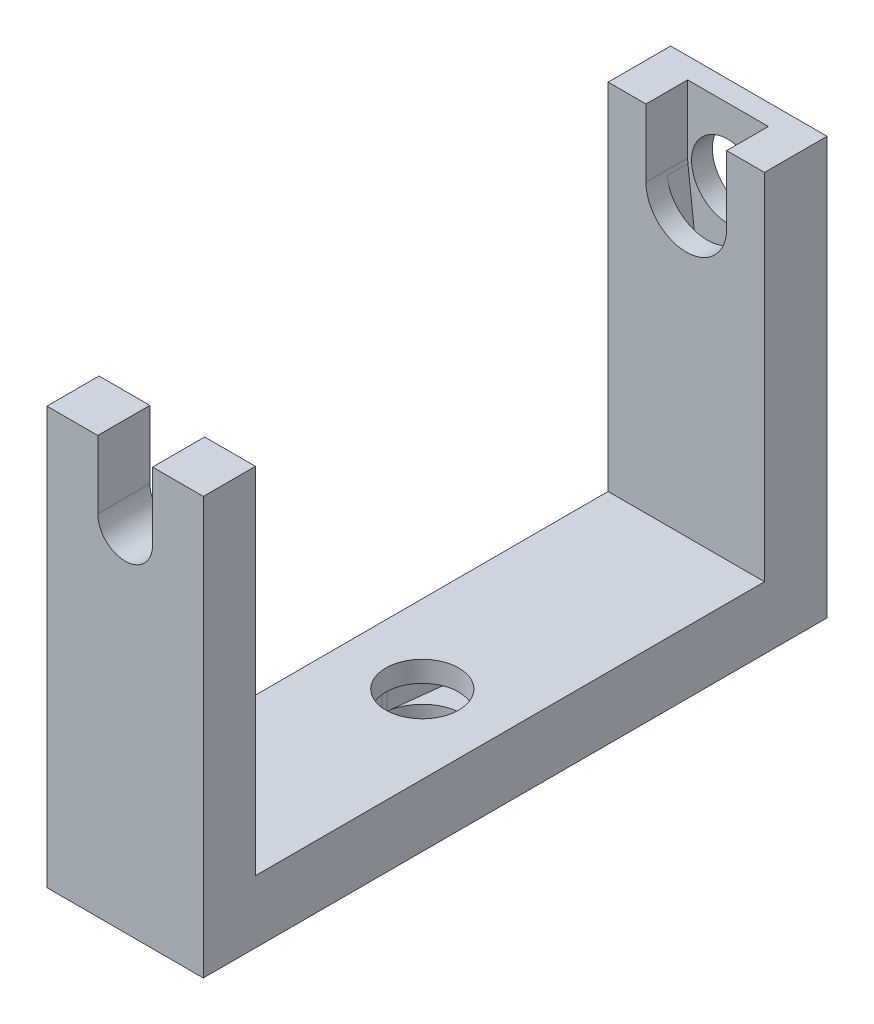
ISO-10303-21;
HEADER;
FILE_DESCRIPTION(('STEP AP214'),'2;1');
FILE_NAME('part.step','',(''),(''),'','','');
FILE_SCHEMA(('AUTOMOTIVE_DESIGN { 1 0 10303 214 1 1 1 1 }'));
ENDSEC;
DATA;
#1=APPLICATION_CONTEXT('core data for automotive mechanical design processes');
#2=APPLICATION_PROTOCOL_DEFINITION('international standard','automotive_design',2000,#1);
#3=PRODUCT_CONTEXT('',#1,'mechanical');
#4=PRODUCT('Part','Part','',(#3));
#5=PRODUCT_RELATED_PRODUCT_CATEGORY('part','',(#4));
#6=PRODUCT_DEFINITION_FORMATION('','',#4);
#7=PRODUCT_DEFINITION_CONTEXT('part definition',#1,'design');
#8=PRODUCT_DEFINITION('design','',#6,#7);
#9=PRODUCT_DEFINITION_SHAPE('','',#8);
#10=(LENGTH_UNIT() NAMED_UNIT(*) SI_UNIT(.MILLI.,.METRE.));
#11=(NAMED_UNIT(*) PLANE_ANGLE_UNIT() SI_UNIT($,.RADIAN.));
#12=(NAMED_UNIT(*) SI_UNIT($,.STERADIAN.) SOLID_ANGLE_UNIT());
#13=UNCERTAINTY_MEASURE_WITH_UNIT(LENGTH_MEASURE(1.E-05),#10,'distance_accuracy_value','');
#14=(GEOMETRIC_REPRESENTATION_CONTEXT(3) GLOBAL_UNCERTAINTY_ASSIGNED_CONTEXT((#13)) GLOBAL_UNIT_ASSIGNED_CONTEXT((#10,
#11,#12)) REPRESENTATION_CONTEXT('',''));
#15=CARTESIAN_POINT('',(0.,0.,0.));
#16=DIRECTION('',(0.,0.,1.));
#17=DIRECTION('',(1.,0.,0.));
#18=AXIS2_PLACEMENT_3D('',#15,#16,#17);
#19=CARTESIAN_POINT('',(7.5,37.,-15.91));
#20=DIRECTION('',(0.,-1.,0.));
#21=DIRECTION('',(0.,0.,-1.));
#22=AXIS2_PLACEMENT_3D('',#19,#20,#21);
#23=PLANE('',#22);
#24=DIRECTION('',(1.,0.,0.));
#25=VECTOR('',#24,1.);
#26=CARTESIAN_POINT('',(-7.5,36.9999999999999,37.91));
#27=LINE('',#26,#25);
#28=CARTESIAN_POINT('',(-7.5,36.9999999999999,37.91));
#29=VERTEX_POINT('',#28);
#30=CARTESIAN_POINT('',(-2.625,36.9999999999999,37.91));
#31=VERTEX_POINT('',#30);
#32=EDGE_CURVE('E258',#29,#31,#27,.T.);
#33=ORIENTED_EDGE('',*,*,#32,.T.);
#34=DIRECTION('',(0.,0.,1.));
#35=VECTOR('',#34,1.);
#36=CARTESIAN_POINT('',(-2.625,36.9999999999999,22.3825062336756));
#37=LINE('',#36,#35);
#38=CARTESIAN_POINT('',(-2.625,36.9999999999999,32.91));
#39=VERTEX_POINT('',#38);
#40=EDGE_CURVE('E251',#39,#31,#37,.T.);
#41=ORIENTED_EDGE('',*,*,#40,.F.);
#42=DIRECTION('',(-1.,0.,0.));
#43=VECTOR('',#42,1.);
#44=CARTESIAN_POINT('',(-7.5,36.9999999999999,32.91));
#45=LINE('',#44,#43);
#46=CARTESIAN_POINT('',(-7.5,36.9999999999999,32.91));
#47=VERTEX_POINT('',#46);
#48=EDGE_CURVE('E240',#39,#47,#45,.T.);
#49=ORIENTED_EDGE('',*,*,#48,.T.);
#50=DIRECTION('',(0.,0.,1.));
#51=VECTOR('',#50,1.);
#52=CARTESIAN_POINT('',(-7.5,36.9999999999999,37.91));
#53=LINE('',#52,#51);
#54=EDGE_CURVE('E261',#47,#29,#53,.T.);
#55=ORIENTED_EDGE('',*,*,#54,.T.);
#56=EDGE_LOOP('',(#33,#41,#49,#55));
#57=FACE_BOUND('',#56,.T.);
#58=ADVANCED_FACE('F33',(#57),#23,.F.);
#59=CARTESIAN_POINT('',(7.5,37.,-15.91));
#60=DIRECTION('',(0.,-1.,0.));
#61=DIRECTION('',(0.,0.,-1.));
#62=AXIS2_PLACEMENT_3D('',#59,#60,#61);
#63=PLANE('',#62);
#64=DIRECTION('',(0.,0.,1.));
#65=VECTOR('',#64,1.);
#66=CARTESIAN_POINT('',(3.86999999999998,37.,-19.91));
#67=LINE('',#66,#65);
#68=CARTESIAN_POINT('',(3.86999999999998,37.,-19.91));
#69=VERTEX_POINT('',#68);
#70=CARTESIAN_POINT('',(3.86999999999998,37.,-15.91));
#71=VERTEX_POINT('',#70);
#72=EDGE_CURVE('E393',#69,#71,#67,.T.);
#73=ORIENTED_EDGE('',*,*,#72,.T.);
#74=DIRECTION('',(-1.,0.,0.));
#75=VECTOR('',#74,1.);
#76=CARTESIAN_POINT('',(7.5,37.,-15.91));
#77=LINE('',#76,#75);
#78=CARTESIAN_POINT('',(7.5,37.,-15.91));
#79=VERTEX_POINT('',#78);
#80=EDGE_CURVE('E432',#79,#71,#77,.T.);
#81=ORIENTED_EDGE('',*,*,#80,.F.);
#82=DIRECTION('',(0.,0.,1.));
#83=VECTOR('',#82,1.);
#84=CARTESIAN_POINT('',(7.5,37.,-15.91));
#85=LINE('',#84,#83);
#86=CARTESIAN_POINT('',(7.5,37.,-21.91));
#87=VERTEX_POINT('',#86);
#88=EDGE_CURVE('E410',#87,#79,#85,.T.);
#89=ORIENTED_EDGE('',*,*,#88,.F.);
#90=DIRECTION('',(-1.,0.,0.));
#91=VECTOR('',#90,1.);
#92=CARTESIAN_POINT('',(7.5,37.,-21.91));
#93=LINE('',#92,#91);
#94=CARTESIAN_POINT('',(-7.5,37.,-21.91));
#95=VERTEX_POINT('',#94);
#96=EDGE_CURVE('E435',#87,#95,#93,.T.);
#97=ORIENTED_EDGE('',*,*,#96,.T.);
#98=DIRECTION('',(0.,0.,1.));
#99=VECTOR('',#98,1.);
#100=CARTESIAN_POINT('',(-7.5,37.,-15.91));
#101=LINE('',#100,#99);
#102=CARTESIAN_POINT('',(-7.5,37.,-15.91));
#103=VERTEX_POINT('',#102);
#104=EDGE_CURVE('E422',#95,#103,#101,.T.);
#105=ORIENTED_EDGE('',*,*,#104,.T.);
#106=CARTESIAN_POINT('',(-3.86999999999998,37.,-15.91));
#107=VERTEX_POINT('',#106);
#108=EDGE_CURVE('E431',#107,#103,#77,.T.);
#109=ORIENTED_EDGE('',*,*,#108,.F.);
#110=DIRECTION('',(0.,0.,1.));
#111=VECTOR('',#110,1.);
#112=CARTESIAN_POINT('',(-3.86999999999998,37.,-19.91));
#113=LINE('',#112,#111);
#114=CARTESIAN_POINT('',(-3.86999999999998,37.,-19.91));
#115=VERTEX_POINT('',#114);
#116=EDGE_CURVE('E391',#115,#107,#113,.T.);
#117=ORIENTED_EDGE('',*,*,#116,.F.);
#118=DIRECTION('',(-1.,0.,0.));
#119=VECTOR('',#118,1.);
#120=CARTESIAN_POINT('',(3.86999999999998,37.,-19.91));
#121=LINE('',#120,#119);
#122=EDGE_CURVE('E363',#69,#115,#121,.T.);
#123=ORIENTED_EDGE('',*,*,#122,.F.);
#124=EDGE_LOOP('',(#73,#81,#89,#97,#105,#109,#117,#123));
#125=FACE_BOUND('',#124,.T.);
#126=ADVANCED_FACE('F491',(#125),#63,.F.);
#127=CARTESIAN_POINT('',(7.5,3.,-15.91));
#128=DIRECTION('',(0.,0.,-1.));
#129=DIRECTION('',(-1.,0.,0.));
#130=AXIS2_PLACEMENT_3D('',#127,#128,#129);
#131=PLANE('',#130);
#132=DIRECTION('',(0.,1.,0.));
#133=VECTOR('',#132,1.);
#134=CARTESIAN_POINT('',(3.87000000000017,2.99999999999998,-15.91));
#135=LINE('',#134,#133);
#136=CARTESIAN_POINT('',(3.87000000000002,30.5,-15.91));
#137=VERTEX_POINT('',#136);
#138=EDGE_CURVE('E343',#137,#71,#135,.T.);
#139=ORIENTED_EDGE('',*,*,#138,.F.);
#140=CARTESIAN_POINT('',(0.,30.5,-15.91));
#141=DIRECTION('',(0.,0.,-1.));
#142=DIRECTION('',(-1.,0.,0.));
#143=AXIS2_PLACEMENT_3D('',#140,#141,#142);
#144=CIRCLE('',#143,3.87);
#145=CARTESIAN_POINT('',(-3.86999999999998,30.5,-15.91));
#146=VERTEX_POINT('',#145);
#147=EDGE_CURVE('E346',#146,#137,#144,.F.);
#148=ORIENTED_EDGE('',*,*,#147,.F.);
#149=DIRECTION('',(0.,-1.,0.));
#150=VECTOR('',#149,1.);
#151=CARTESIAN_POINT('',(-3.86999999999998,3.,-15.91));
#152=LINE('',#151,#150);
#153=EDGE_CURVE('E340',#107,#146,#152,.T.);
#154=ORIENTED_EDGE('',*,*,#153,.F.);
#155=ORIENTED_EDGE('',*,*,#108,.T.);
#156=DIRECTION('',(0.,-1.,0.));
#157=VECTOR('',#156,1.);
#158=CARTESIAN_POINT('',(-7.5,3.,-15.91));
#159=LINE('',#158,#157);
#160=CARTESIAN_POINT('',(-7.5,3.,-15.91));
#161=VERTEX_POINT('',#160);
#162=EDGE_CURVE('E425',#103,#161,#159,.T.);
#163=ORIENTED_EDGE('',*,*,#162,.T.);
#164=DIRECTION('',(-1.,0.,0.));
#165=VECTOR('',#164,1.);
#166=CARTESIAN_POINT('',(7.5,3.,-15.91));
#167=LINE('',#166,#165);
#168=CARTESIAN_POINT('',(7.5,3.,-15.91));
#169=VERTEX_POINT('',#168);
#170=EDGE_CURVE('E417',#169,#161,#167,.T.);
#171=ORIENTED_EDGE('',*,*,#170,.F.);
#172=DIRECTION('',(0.,-1.,0.));
#173=VECTOR('',#172,1.);
#174=CARTESIAN_POINT('',(7.5,3.,-15.91));
#175=LINE('',#174,#173);
#176=EDGE_CURVE('E412',#79,#169,#175,.T.);
#177=ORIENTED_EDGE('',*,*,#176,.F.);
#178=ORIENTED_EDGE('',*,*,#80,.T.);
#179=EDGE_LOOP('',(#139,#148,#154,#155,#163,#171,#177,#178));
#180=FACE_BOUND('',#179,.T.);
#181=ADVANCED_FACE('F498',(#180),#131,.F.);
#182=CARTESIAN_POINT('',(0.,16.42,-17.91));
#183=DIRECTION('',(0.,0.,1.));
#184=DIRECTION('',(1.,0.,0.));
#185=AXIS2_PLACEMENT_3D('',#182,#183,#184);
#186=PLANE('',#185);
#187=CARTESIAN_POINT('',(0.,30.5,-17.91));
#188=DIRECTION('',(0.,0.,1.));
#189=DIRECTION('',(1.,0.,0.));
#190=AXIS2_PLACEMENT_3D('',#187,#188,#189);
#191=CIRCLE('',#190,3.87);
#192=CARTESIAN_POINT('',(3.84429899049201,30.0547301136363,-17.91));
#193=VERTEX_POINT('',#192);
#194=CARTESIAN_POINT('',(-3.84429899049197,30.0547301136363,-17.91));
#195=VERTEX_POINT('',#194);
#196=EDGE_CURVE('E441',#193,#195,#191,.F.);
#197=ORIENTED_EDGE('',*,*,#196,.F.);
#198=DIRECTION('',(0.115056818181818,0.993358912271831,0.));
#199=VECTOR('',#198,1.);
#200=CARTESIAN_POINT('',(2.23505755261164,16.1611221590909,-17.91));
#201=LINE('',#200,#199);
#202=CARTESIAN_POINT('',(2.23505755261164,16.1611221590909,-17.91));
#203=VERTEX_POINT('',#202);
#204=EDGE_CURVE('E378',#203,#193,#201,.T.);
#205=ORIENTED_EDGE('',*,*,#204,.F.);
#206=CARTESIAN_POINT('',(0.,16.42,-17.91));
#207=DIRECTION('',(0.,0.,1.));
#208=DIRECTION('',(1.,0.,0.));
#209=AXIS2_PLACEMENT_3D('',#206,#207,#208);
#210=CIRCLE('',#209,2.25);
#211=CARTESIAN_POINT('',(-2.2350575526116,16.1611221590909,-17.91));
#212=VERTEX_POINT('',#211);
#213=EDGE_CURVE('E349',#212,#203,#210,.T.);
#214=ORIENTED_EDGE('',*,*,#213,.F.);
#215=DIRECTION('',(0.115056818181818,-0.993358912271831,0.));
#216=VECTOR('',#215,1.);
#217=CARTESIAN_POINT('',(-3.84429899049197,30.0547301136364,-17.91));
#218=LINE('',#217,#216);
#219=EDGE_CURVE('E354',#195,#212,#218,.T.);
#220=ORIENTED_EDGE('',*,*,#219,.F.);
#221=EDGE_LOOP('',(#197,#205,#214,#220));
#222=FACE_BOUND('',#221,.T.);
#223=ADVANCED_FACE('F580',(#222),#186,.F.);
#224=CARTESIAN_POINT('',(0.,30.5,-21.91));
#225=DIRECTION('',(0.,0.,1.));
#226=DIRECTION('',(1.,0.,0.));
#227=AXIS2_PLACEMENT_3D('',#224,#225,#226);
#228=CYLINDRICAL_SURFACE('',#227,3.5);
#229=CARTESIAN_POINT('',(0.,30.5,-21.91));
#230=DIRECTION('',(0.,0.,1.));
#231=DIRECTION('',(1.,0.,0.));
#232=AXIS2_PLACEMENT_3D('',#229,#230,#231);
#233=CIRCLE('',#232,3.5);
#234=CARTESIAN_POINT('',(3.5,30.5,-21.91));
#235=VERTEX_POINT('',#234);
#236=EDGE_CURVE('E401',#235,#235,#233,.T.);
#237=ORIENTED_EDGE('',*,*,#236,.F.);
#238=EDGE_LOOP('',(#237));
#239=FACE_BOUND('',#238,.T.);
#240=CARTESIAN_POINT('',(0.,30.5,-19.91));
#241=DIRECTION('',(0.,0.,1.));
#242=DIRECTION('',(1.,0.,0.));
#243=AXIS2_PLACEMENT_3D('',#240,#241,#242);
#244=CIRCLE('',#243,3.5);
#245=CARTESIAN_POINT('',(3.5,30.5,-19.91));
#246=VERTEX_POINT('',#245);
#247=EDGE_CURVE('E385',#246,#246,#244,.F.);
#248=ORIENTED_EDGE('',*,*,#247,.F.);
#249=EDGE_LOOP('',(#248));
#250=FACE_BOUND('',#249,.T.);
#251=ADVANCED_FACE('F577',(#239,#250),#228,.F.);
#252=CARTESIAN_POINT('',(7.5,-3.,-21.91));
#253=DIRECTION('',(0.,1.,0.));
#254=DIRECTION('',(0.,0.,1.));
#255=AXIS2_PLACEMENT_3D('',#252,#253,#254);
#256=PLANE('',#255);
#257=DIRECTION('',(1.,0.,0.));
#258=VECTOR('',#257,1.);
#259=CARTESIAN_POINT('',(-7.5,-3.,32.91));
#260=LINE('',#259,#258);
#261=CARTESIAN_POINT('',(-3.86999999999999,-3.,32.91));
#262=VERTEX_POINT('',#261);
#263=CARTESIAN_POINT('',(3.86999999999999,-3.,32.91));
#264=VERTEX_POINT('',#263);
#265=EDGE_CURVE('E254',#262,#264,#260,.T.);
#266=ORIENTED_EDGE('',*,*,#265,.T.);
#267=DIRECTION('',(0.,0.,-1.));
#268=VECTOR('',#267,1.);
#269=CARTESIAN_POINT('',(3.86999999999999,-3.,15.91));
#270=LINE('',#269,#268);
#271=CARTESIAN_POINT('',(3.86999999999999,-3.,9.40999999999992));
#272=VERTEX_POINT('',#271);
#273=EDGE_CURVE('E292',#264,#272,#270,.T.);
#274=ORIENTED_EDGE('',*,*,#273,.T.);
#275=CARTESIAN_POINT('',(0.,-3.,9.40999999999992));
#276=DIRECTION('',(0.,1.,0.));
#277=DIRECTION('',(0.,0.,-1.));
#278=AXIS2_PLACEMENT_3D('',#275,#276,#277);
#279=CIRCLE('',#278,3.86999999999999);
#280=CARTESIAN_POINT('',(-3.86999999999999,-3.,9.40999999999995));
#281=VERTEX_POINT('',#280);
#282=EDGE_CURVE('E294',#272,#281,#279,.T.);
#283=ORIENTED_EDGE('',*,*,#282,.T.);
#284=DIRECTION('',(0.,0.,1.));
#285=VECTOR('',#284,1.);
#286=CARTESIAN_POINT('',(-3.86999999999999,-3.,9.40999999999995));
#287=LINE('',#286,#285);
#288=EDGE_CURVE('E289',#281,#262,#287,.T.);
#289=ORIENTED_EDGE('',*,*,#288,.T.);
#290=EDGE_LOOP('',(#266,#274,#283,#289));
#291=FACE_BOUND('',#290,.T.);
#292=DIRECTION('',(-1.,0.,0.));
#293=VECTOR('',#292,1.);
#294=CARTESIAN_POINT('',(7.5,-3.,-21.91));
#295=LINE('',#294,#293);
#296=CARTESIAN_POINT('',(7.5,-3.,-21.91));
#297=VERTEX_POINT('',#296);
#298=CARTESIAN_POINT('',(-7.5,-3.,-21.91));
#299=VERTEX_POINT('',#298);
#300=EDGE_CURVE('E438',#297,#299,#295,.T.);
#301=ORIENTED_EDGE('',*,*,#300,.F.);
#302=DIRECTION('',(0.,0.,-1.));
#303=VECTOR('',#302,1.);
#304=CARTESIAN_POINT('',(7.5,-3.,-21.91));
#305=LINE('',#304,#303);
#306=CARTESIAN_POINT('',(7.5,-3.,37.91));
#307=VERTEX_POINT('',#306);
#308=EDGE_CURVE('E405',#307,#297,#305,.T.);
#309=ORIENTED_EDGE('',*,*,#308,.F.);
#310=DIRECTION('',(1.,0.,0.));
#311=VECTOR('',#310,1.);
#312=CARTESIAN_POINT('',(-7.5,-3.,37.91));
#313=LINE('',#312,#311);
#314=CARTESIAN_POINT('',(-7.5,-3.,37.91));
#315=VERTEX_POINT('',#314);
#316=EDGE_CURVE('E284',#315,#307,#313,.T.);
#317=ORIENTED_EDGE('',*,*,#316,.F.);
#318=DIRECTION('',(0.,0.,-1.));
#319=VECTOR('',#318,1.);
#320=CARTESIAN_POINT('',(-7.5,-3.,-21.91));
#321=LINE('',#320,#319);
#322=EDGE_CURVE('E418',#315,#299,#321,.T.);
#323=ORIENTED_EDGE('',*,*,#322,.T.);
#324=EDGE_LOOP('',(#301,#309,#317,#323));
#325=FACE_BOUND('',#324,.T.);
#326=ADVANCED_FACE('F35',(#291,#325),#256,.F.);
#327=CARTESIAN_POINT('',(7.5,37.,-21.91));
#328=DIRECTION('',(0.,0.,1.));
#329=DIRECTION('',(0.,-1.,0.));
#330=AXIS2_PLACEMENT_3D('',#327,#328,#329);
#331=PLANE('',#330);
#332=ORIENTED_EDGE('',*,*,#236,.T.);
#333=EDGE_LOOP('',(#332));
#334=FACE_BOUND('',#333,.T.);
#335=DIRECTION('',(0.,1.,0.));
#336=VECTOR('',#335,1.);
#337=CARTESIAN_POINT('',(-7.5,37.,-21.91));
#338=LINE('',#337,#336);
#339=EDGE_CURVE('E420',#299,#95,#338,.T.);
#340=ORIENTED_EDGE('',*,*,#339,.T.);
#341=ORIENTED_EDGE('',*,*,#96,.F.);
#342=DIRECTION('',(0.,1.,0.));
#343=VECTOR('',#342,1.);
#344=CARTESIAN_POINT('',(7.5,37.,-21.91));
#345=LINE('',#344,#343);
#346=EDGE_CURVE('E407',#297,#87,#345,.T.);
#347=ORIENTED_EDGE('',*,*,#346,.F.);
#348=ORIENTED_EDGE('',*,*,#300,.T.);
#349=EDGE_LOOP('',(#340,#341,#347,#348));
#350=FACE_BOUND('',#349,.T.);
#351=ADVANCED_FACE('F537',(#334,#350),#331,.F.);
#352=CARTESIAN_POINT('',(7.5,3.,15.91));
#353=DIRECTION('',(0.,-1.,0.));
#354=DIRECTION('',(0.,0.,-1.));
#355=AXIS2_PLACEMENT_3D('',#352,#353,#354);
#356=PLANE('',#355);
#357=CARTESIAN_POINT('',(0.,3.,9.41));
#358=DIRECTION('',(0.,-1.,0.));
#359=DIRECTION('',(0.,0.,-1.));
#360=AXIS2_PLACEMENT_3D('',#357,#358,#359);
#361=CIRCLE('',#360,3.5);
#362=CARTESIAN_POINT('',(0.,3.,5.91));
#363=VERTEX_POINT('',#362);
#364=EDGE_CURVE('E404',#363,#363,#361,.F.);
#365=ORIENTED_EDGE('',*,*,#364,.F.);
#366=EDGE_LOOP('',(#365));
#367=FACE_BOUND('',#366,.T.);
#368=DIRECTION('',(0.,0.,1.));
#369=VECTOR('',#368,1.);
#370=CARTESIAN_POINT('',(-7.5,3.,15.91));
#371=LINE('',#370,#369);
#372=CARTESIAN_POINT('',(-7.5,3.,32.91));
#373=VERTEX_POINT('',#372);
#374=EDGE_CURVE('E408',#161,#373,#371,.T.);
#375=ORIENTED_EDGE('',*,*,#374,.T.);
#376=DIRECTION('',(1.,0.,0.));
#377=VECTOR('',#376,1.);
#378=CARTESIAN_POINT('',(7.5,3.,32.91));
#379=LINE('',#378,#377);
#380=CARTESIAN_POINT('',(7.5,3.,32.91));
#381=VERTEX_POINT('',#380);
#382=EDGE_CURVE('E279',#373,#381,#379,.T.);
#383=ORIENTED_EDGE('',*,*,#382,.T.);
#384=DIRECTION('',(0.,0.,1.));
#385=VECTOR('',#384,1.);
#386=CARTESIAN_POINT('',(7.5,3.,15.91));
#387=LINE('',#386,#385);
#388=EDGE_CURVE('E414',#169,#381,#387,.T.);
#389=ORIENTED_EDGE('',*,*,#388,.F.);
#390=ORIENTED_EDGE('',*,*,#170,.T.);
#391=EDGE_LOOP('',(#375,#383,#389,#390));
#392=FACE_BOUND('',#391,.T.);
#393=ADVANCED_FACE('F524',(#367,#392),#356,.F.);
#394=CARTESIAN_POINT('',(7.5,0.,0.));
#395=DIRECTION('',(-1.,0.,0.));
#396=DIRECTION('',(0.,0.,1.));
#397=AXIS2_PLACEMENT_3D('',#394,#395,#396);
#398=PLANE('',#397);
#399=ORIENTED_EDGE('',*,*,#388,.T.);
#400=DIRECTION('',(0.,-1.,0.));
#401=VECTOR('',#400,1.);
#402=CARTESIAN_POINT('',(7.5,52.8113883008418,32.91));
#403=LINE('',#402,#401);
#404=CARTESIAN_POINT('',(7.5,36.9999999999999,32.91));
#405=VERTEX_POINT('',#404);
#406=EDGE_CURVE('E56',#405,#381,#403,.T.);
#407=ORIENTED_EDGE('',*,*,#406,.F.);
#408=DIRECTION('',(0.,0.,-1.));
#409=VECTOR('',#408,1.);
#410=CARTESIAN_POINT('',(7.5,36.9999999999999,37.91));
#411=LINE('',#410,#409);
#412=CARTESIAN_POINT('',(7.5,36.9999999999999,37.91));
#413=VERTEX_POINT('',#412);
#414=EDGE_CURVE('E255',#413,#405,#411,.T.);
#415=ORIENTED_EDGE('',*,*,#414,.F.);
#416=DIRECTION('',(0.,1.,0.));
#417=VECTOR('',#416,1.);
#418=CARTESIAN_POINT('',(7.5,-3.,37.91));
#419=LINE('',#418,#417);
#420=EDGE_CURVE('E286',#307,#413,#419,.T.);
#421=ORIENTED_EDGE('',*,*,#420,.F.);
#422=ORIENTED_EDGE('',*,*,#308,.T.);
#423=ORIENTED_EDGE('',*,*,#346,.T.);
#424=ORIENTED_EDGE('',*,*,#88,.T.);
#425=ORIENTED_EDGE('',*,*,#176,.T.);
#426=EDGE_LOOP('',(#399,#407,#415,#421,#422,#423,#424,#425));
#427=FACE_BOUND('',#426,.T.);
#428=ADVANCED_FACE('F519',(#427),#398,.F.);
#429=CARTESIAN_POINT('',(-7.5,0.,0.));
#430=DIRECTION('',(-1.,0.,0.));
#431=DIRECTION('',(0.,0.,1.));
#432=AXIS2_PLACEMENT_3D('',#429,#430,#431);
#433=PLANE('',#432);
#434=ORIENTED_EDGE('',*,*,#339,.F.);
#435=ORIENTED_EDGE('',*,*,#322,.F.);
#436=DIRECTION('',(0.,-1.,0.));
#437=VECTOR('',#436,1.);
#438=CARTESIAN_POINT('',(-7.5,3.,37.91));
#439=LINE('',#438,#437);
#440=EDGE_CURVE('E281',#29,#315,#439,.T.);
#441=ORIENTED_EDGE('',*,*,#440,.F.);
#442=ORIENTED_EDGE('',*,*,#54,.F.);
#443=DIRECTION('',(0.,-1.,0.));
#444=VECTOR('',#443,1.);
#445=CARTESIAN_POINT('',(-7.5,52.8113883008418,32.91));
#446=LINE('',#445,#444);
#447=EDGE_CURVE('E266',#47,#373,#446,.T.);
#448=ORIENTED_EDGE('',*,*,#447,.T.);
#449=ORIENTED_EDGE('',*,*,#374,.F.);
#450=ORIENTED_EDGE('',*,*,#162,.F.);
#451=ORIENTED_EDGE('',*,*,#104,.F.);
#452=EDGE_LOOP('',(#434,#435,#441,#442,#448,#449,#450,#451));
#453=FACE_BOUND('',#452,.T.);
#454=ADVANCED_FACE('F529',(#453),#433,.T.);
#455=CARTESIAN_POINT('',(0.,37.,9.41));
#456=DIRECTION('',(0.,-1.,0.));
#457=DIRECTION('',(0.,0.,-1.));
#458=AXIS2_PLACEMENT_3D('',#455,#456,#457);
#459=CYLINDRICAL_SURFACE('',#458,3.5);
#460=CARTESIAN_POINT('',(0.,1.,9.41));
#461=DIRECTION('',(0.,1.,0.));
#462=DIRECTION('',(0.,0.,1.));
#463=AXIS2_PLACEMENT_3D('',#460,#461,#462);
#464=CIRCLE('',#463,3.5);
#465=CARTESIAN_POINT('',(0.,1.,12.91));
#466=VERTEX_POINT('',#465);
#467=EDGE_CURVE('E329',#466,#466,#464,.T.);
#468=ORIENTED_EDGE('',*,*,#467,.F.);
#469=EDGE_LOOP('',(#468));
#470=FACE_BOUND('',#469,.T.);
#471=ORIENTED_EDGE('',*,*,#364,.T.);
#472=EDGE_LOOP('',(#471));
#473=FACE_BOUND('',#472,.T.);
#474=ADVANCED_FACE('F582',(#470,#473),#459,.F.);
#475=CARTESIAN_POINT('',(0.,16.42,-19.91));
#476=DIRECTION('',(0.,0.,1.));
#477=DIRECTION('',(1.,0.,0.));
#478=AXIS2_PLACEMENT_3D('',#475,#476,#477);
#479=PLANE('',#478);
#480=CARTESIAN_POINT('',(0.,30.5,-19.91));
#481=DIRECTION('',(0.,0.,1.));
#482=DIRECTION('',(1.,0.,0.));
#483=AXIS2_PLACEMENT_3D('',#480,#481,#482);
#484=CIRCLE('',#483,3.87);
#485=CARTESIAN_POINT('',(-3.86999999999998,30.5,-19.91));
#486=VERTEX_POINT('',#485);
#487=CARTESIAN_POINT('',(-3.84429899049197,30.0547301136364,-19.91));
#488=VERTEX_POINT('',#487);
#489=EDGE_CURVE('E369',#486,#488,#484,.T.);
#490=ORIENTED_EDGE('',*,*,#489,.T.);
#491=DIRECTION('',(0.115056818181818,-0.993358912271831,0.));
#492=VECTOR('',#491,1.);
#493=CARTESIAN_POINT('',(-3.84429899049197,30.0547301136364,-19.91));
#494=LINE('',#493,#492);
#495=CARTESIAN_POINT('',(-2.2350575526116,16.1611221590909,-19.91));
#496=VERTEX_POINT('',#495);
#497=EDGE_CURVE('E372',#488,#496,#494,.T.);
#498=ORIENTED_EDGE('',*,*,#497,.T.);
#499=CARTESIAN_POINT('',(0.,16.42,-19.91));
#500=DIRECTION('',(0.,0.,1.));
#501=DIRECTION('',(1.,0.,0.));
#502=AXIS2_PLACEMENT_3D('',#499,#500,#501);
#503=CIRCLE('',#502,2.25);
#504=CARTESIAN_POINT('',(2.23505755261164,16.1611221590909,-19.91));
#505=VERTEX_POINT('',#504);
#506=EDGE_CURVE('E350',#496,#505,#503,.T.);
#507=ORIENTED_EDGE('',*,*,#506,.T.);
#508=DIRECTION('',(0.115056818181818,0.993358912271831,0.));
#509=VECTOR('',#508,1.);
#510=CARTESIAN_POINT('',(2.23505755261164,16.1611221590909,-19.91));
#511=LINE('',#510,#509);
#512=CARTESIAN_POINT('',(3.84429899049201,30.0547301136364,-19.91));
#513=VERTEX_POINT('',#512);
#514=EDGE_CURVE('E353',#505,#513,#511,.T.);
#515=ORIENTED_EDGE('',*,*,#514,.T.);
#516=CARTESIAN_POINT('',(0.,30.5,-19.91));
#517=DIRECTION('',(0.,0.,1.));
#518=DIRECTION('',(1.,0.,0.));
#519=AXIS2_PLACEMENT_3D('',#516,#517,#518);
#520=CIRCLE('',#519,3.87);
#521=CARTESIAN_POINT('',(3.87000000000002,30.5,-19.91));
#522=VERTEX_POINT('',#521);
#523=EDGE_CURVE('E357',#513,#522,#520,.T.);
#524=ORIENTED_EDGE('',*,*,#523,.T.);
#525=DIRECTION('',(0.,1.,0.));
#526=VECTOR('',#525,1.);
#527=CARTESIAN_POINT('',(3.87000000000002,30.5,-19.91));
#528=LINE('',#527,#526);
#529=EDGE_CURVE('E360',#522,#69,#528,.T.);
#530=ORIENTED_EDGE('',*,*,#529,.T.);
#531=ORIENTED_EDGE('',*,*,#122,.T.);
#532=DIRECTION('',(0.,-1.,0.));
#533=VECTOR('',#532,1.);
#534=CARTESIAN_POINT('',(-3.86999999999998,37.,-19.91));
#535=LINE('',#534,#533);
#536=EDGE_CURVE('E366',#115,#486,#535,.T.);
#537=ORIENTED_EDGE('',*,*,#536,.T.);
#538=EDGE_LOOP('',(#490,#498,#507,#515,#524,#530,#531,#537));
#539=FACE_BOUND('',#538,.T.);
#540=ORIENTED_EDGE('',*,*,#247,.T.);
#541=EDGE_LOOP('',(#540));
#542=FACE_BOUND('',#541,.T.);
#543=ADVANCED_FACE('F556',(#539,#542),#479,.T.);
#544=CARTESIAN_POINT('',(0.,16.42,-19.91));
#545=DIRECTION('',(0.,0.,1.));
#546=DIRECTION('',(1.,0.,0.));
#547=AXIS2_PLACEMENT_3D('',#544,#545,#546);
#548=CYLINDRICAL_SURFACE('',#547,2.25);
#549=ORIENTED_EDGE('',*,*,#213,.T.);
#550=DIRECTION('',(0.,0.,1.));
#551=VECTOR('',#550,1.);
#552=CARTESIAN_POINT('',(2.23505755261164,16.1611221590909,-19.91));
#553=LINE('',#552,#551);
#554=EDGE_CURVE('E375',#505,#203,#553,.T.);
#555=ORIENTED_EDGE('',*,*,#554,.F.);
#556=ORIENTED_EDGE('',*,*,#506,.F.);
#557=DIRECTION('',(0.,0.,1.));
#558=VECTOR('',#557,1.);
#559=CARTESIAN_POINT('',(-2.2350575526116,16.1611221590909,-19.91));
#560=LINE('',#559,#558);
#561=EDGE_CURVE('E383',#496,#212,#560,.T.);
#562=ORIENTED_EDGE('',*,*,#561,.T.);
#563=EDGE_LOOP('',(#549,#555,#556,#562));
#564=FACE_BOUND('',#563,.T.);
#565=ADVANCED_FACE('F572',(#564),#548,.F.);
#566=CARTESIAN_POINT('',(-3.84429899049197,30.0547301136364,-19.91));
#567=DIRECTION('',(-0.993358912271831,-0.115056818181818,0.));
#568=DIRECTION('',(0.115056818181818,-0.993358912271831,0.));
#569=AXIS2_PLACEMENT_3D('',#566,#567,#568);
#570=PLANE('',#569);
#571=ORIENTED_EDGE('',*,*,#219,.T.);
#572=ORIENTED_EDGE('',*,*,#561,.F.);
#573=ORIENTED_EDGE('',*,*,#497,.F.);
#574=DIRECTION('',(0.,0.,1.));
#575=VECTOR('',#574,1.);
#576=CARTESIAN_POINT('',(-3.84429899049197,30.0547301136364,-19.91));
#577=LINE('',#576,#575);
#578=EDGE_CURVE('E386',#488,#195,#577,.T.);
#579=ORIENTED_EDGE('',*,*,#578,.T.);
#580=EDGE_LOOP('',(#571,#572,#573,#579));
#581=FACE_BOUND('',#580,.T.);
#582=ADVANCED_FACE('F575',(#581),#570,.F.);
#583=CARTESIAN_POINT('',(0.,30.5,-19.91));
#584=DIRECTION('',(0.,0.,1.));
#585=DIRECTION('',(1.,0.,0.));
#586=AXIS2_PLACEMENT_3D('',#583,#584,#585);
#587=CYLINDRICAL_SURFACE('',#586,3.87);
#588=DIRECTION('',(0.,0.,1.));
#589=VECTOR('',#588,1.);
#590=CARTESIAN_POINT('',(-3.86999999999998,30.5,-19.91));
#591=LINE('',#590,#589);
#592=EDGE_CURVE('E389',#486,#146,#591,.T.);
#593=ORIENTED_EDGE('',*,*,#592,.T.);
#594=ORIENTED_EDGE('',*,*,#147,.T.);
#595=DIRECTION('',(0.,0.,1.));
#596=VECTOR('',#595,1.);
#597=CARTESIAN_POINT('',(3.87000000000002,30.5,-19.91));
#598=LINE('',#597,#596);
#599=EDGE_CURVE('E395',#522,#137,#598,.T.);
#600=ORIENTED_EDGE('',*,*,#599,.F.);
#601=ORIENTED_EDGE('',*,*,#523,.F.);
#602=DIRECTION('',(0.,0.,1.));
#603=VECTOR('',#602,1.);
#604=CARTESIAN_POINT('',(3.84429899049201,30.0547301136364,-19.91));
#605=LINE('',#604,#603);
#606=EDGE_CURVE('E397',#513,#193,#605,.T.);
#607=ORIENTED_EDGE('',*,*,#606,.T.);
#608=ORIENTED_EDGE('',*,*,#196,.T.);
#609=ORIENTED_EDGE('',*,*,#578,.F.);
#610=ORIENTED_EDGE('',*,*,#489,.F.);
#611=EDGE_LOOP('',(#593,#594,#600,#601,#607,#608,#609,#610));
#612=FACE_BOUND('',#611,.T.);
#613=ADVANCED_FACE('F550',(#612),#587,.F.);
#614=CARTESIAN_POINT('',(-3.86999999999998,37.,-19.91));
#615=DIRECTION('',(-1.,0.,0.));
#616=DIRECTION('',(0.,0.,1.));
#617=AXIS2_PLACEMENT_3D('',#614,#615,#616);
#618=PLANE('',#617);
#619=ORIENTED_EDGE('',*,*,#116,.T.);
#620=ORIENTED_EDGE('',*,*,#153,.T.);
#621=ORIENTED_EDGE('',*,*,#592,.F.);
#622=ORIENTED_EDGE('',*,*,#536,.F.);
#623=EDGE_LOOP('',(#619,#620,#621,#622));
#624=FACE_BOUND('',#623,.T.);
#625=ADVANCED_FACE('F547',(#624),#618,.F.);
#626=CARTESIAN_POINT('',(3.87000000000002,30.5,-19.91));
#627=DIRECTION('',(1.,0.,0.));
#628=DIRECTION('',(0.,1.,0.));
#629=AXIS2_PLACEMENT_3D('',#626,#627,#628);
#630=PLANE('',#629);
#631=ORIENTED_EDGE('',*,*,#599,.T.);
#632=ORIENTED_EDGE('',*,*,#138,.T.);
#633=ORIENTED_EDGE('',*,*,#72,.F.);
#634=ORIENTED_EDGE('',*,*,#529,.F.);
#635=EDGE_LOOP('',(#631,#632,#633,#634));
#636=FACE_BOUND('',#635,.T.);
#637=ADVANCED_FACE('F559',(#636),#630,.F.);
#638=CARTESIAN_POINT('',(2.23505755261164,16.1611221590909,-19.91));
#639=DIRECTION('',(0.993358912271831,-0.115056818181818,0.));
#640=DIRECTION('',(0.115056818181818,0.993358912271832,0.));
#641=AXIS2_PLACEMENT_3D('',#638,#639,#640);
#642=PLANE('',#641);
#643=ORIENTED_EDGE('',*,*,#204,.T.);
#644=ORIENTED_EDGE('',*,*,#606,.F.);
#645=ORIENTED_EDGE('',*,*,#514,.F.);
#646=ORIENTED_EDGE('',*,*,#554,.T.);
#647=EDGE_LOOP('',(#643,#644,#645,#646));
#648=FACE_BOUND('',#647,.T.);
#649=ADVANCED_FACE('F561',(#648),#642,.F.);
#650=CARTESIAN_POINT('',(0.,-1.,9.40999999999992));
#651=DIRECTION('',(0.,1.,0.));
#652=DIRECTION('',(0.,0.,1.));
#653=AXIS2_PLACEMENT_3D('',#650,#651,#652);
#654=CYLINDRICAL_SURFACE('',#653,3.87);
#655=DIRECTION('',(0.,1.,0.));
#656=VECTOR('',#655,1.);
#657=CARTESIAN_POINT('',(-3.84429899049198,-1.,8.96473011363629));
#658=LINE('',#657,#656);
#659=CARTESIAN_POINT('',(-3.84429899049198,-1.,8.96473011363629));
#660=VERTEX_POINT('',#659);
#661=CARTESIAN_POINT('',(-3.84429899049198,1.,8.96473011363629));
#662=VERTEX_POINT('',#661);
#663=EDGE_CURVE('E327',#660,#662,#658,.T.);
#664=ORIENTED_EDGE('',*,*,#663,.T.);
#665=CARTESIAN_POINT('',(0.,1.,9.40999999999992));
#666=DIRECTION('',(0.,1.,0.));
#667=DIRECTION('',(0.,0.,1.));
#668=AXIS2_PLACEMENT_3D('',#665,#666,#667);
#669=CIRCLE('',#668,3.87);
#670=CARTESIAN_POINT('',(-3.86999999999999,1.,9.40999999999995));
#671=VERTEX_POINT('',#670);
#672=EDGE_CURVE('E297',#662,#671,#669,.T.);
#673=ORIENTED_EDGE('',*,*,#672,.T.);
#674=DIRECTION('',(0.,1.,0.));
#675=VECTOR('',#674,1.);
#676=CARTESIAN_POINT('',(-3.86999999999999,-1.,9.40999999999995));
#677=LINE('',#676,#675);
#678=EDGE_CURVE('E308',#281,#671,#677,.T.);
#679=ORIENTED_EDGE('',*,*,#678,.F.);
#680=ORIENTED_EDGE('',*,*,#282,.F.);
#681=DIRECTION('',(0.,1.,0.));
#682=VECTOR('',#681,1.);
#683=CARTESIAN_POINT('',(3.86999999999999,-1.,9.40999999999992));
#684=LINE('',#683,#682);
#685=CARTESIAN_POINT('',(3.86999999999999,1.,9.40999999999992));
#686=VERTEX_POINT('',#685);
#687=EDGE_CURVE('E336',#272,#686,#684,.T.);
#688=ORIENTED_EDGE('',*,*,#687,.T.);
#689=CARTESIAN_POINT('',(0.,1.,9.40999999999992));
#690=DIRECTION('',(0.,1.,0.));
#691=DIRECTION('',(0.,0.,1.));
#692=AXIS2_PLACEMENT_3D('',#689,#690,#691);
#693=CIRCLE('',#692,3.86999999999999);
#694=CARTESIAN_POINT('',(3.84429899049198,1.,8.96473011363629));
#695=VERTEX_POINT('',#694);
#696=EDGE_CURVE('E316',#686,#695,#693,.T.);
#697=ORIENTED_EDGE('',*,*,#696,.T.);
#698=DIRECTION('',(0.,1.,0.));
#699=VECTOR('',#698,1.);
#700=CARTESIAN_POINT('',(3.84429899049198,-1.,8.96473011363629));
#701=LINE('',#700,#699);
#702=CARTESIAN_POINT('',(3.84429899049199,-1.,8.96473011363629));
#703=VERTEX_POINT('',#702);
#704=EDGE_CURVE('E334',#703,#695,#701,.T.);
#705=ORIENTED_EDGE('',*,*,#704,.F.);
#706=CARTESIAN_POINT('',(0.,-1.,9.40999999999992));
#707=DIRECTION('',(0.,1.,0.));
#708=DIRECTION('',(0.,0.,1.));
#709=AXIS2_PLACEMENT_3D('',#706,#707,#708);
#710=CIRCLE('',#709,3.86999999999999);
#711=EDGE_CURVE('E41',#703,#660,#710,.T.);
#712=ORIENTED_EDGE('',*,*,#711,.T.);
#713=EDGE_LOOP('',(#664,#673,#679,#680,#688,#697,#705,#712));
#714=FACE_BOUND('',#713,.T.);
#715=ADVANCED_FACE('F451',(#714),#654,.F.);
#716=CARTESIAN_POINT('',(-2.23505755261159,-1.,-4.92887784090906));
#717=DIRECTION('',(-0.993358912271831,0.,-0.115056818181821));
#718=DIRECTION('',(-0.115056818181821,0.,0.993358912271831));
#719=AXIS2_PLACEMENT_3D('',#716,#717,#718);
#720=PLANE('',#719);
#721=DIRECTION('',(-0.115056818181821,0.,0.993358912271831));
#722=VECTOR('',#721,1.);
#723=CARTESIAN_POINT('',(-2.23505755261159,1.,-4.92887784090906));
#724=LINE('',#723,#722);
#725=CARTESIAN_POINT('',(-2.23505755261157,1.,-4.92887784090906));
#726=VERTEX_POINT('',#725);
#727=EDGE_CURVE('E302',#726,#662,#724,.T.);
#728=ORIENTED_EDGE('',*,*,#727,.T.);
#729=ORIENTED_EDGE('',*,*,#663,.F.);
#730=DIRECTION('',(-0.115056818181821,0.,0.993358912271831));
#731=VECTOR('',#730,1.);
#732=CARTESIAN_POINT('',(-2.23505755261159,-1.,-4.92887784090906));
#733=LINE('',#732,#731);
#734=CARTESIAN_POINT('',(-2.23505755261157,-1.,-4.92887784090906));
#735=VERTEX_POINT('',#734);
#736=EDGE_CURVE('E305',#735,#660,#733,.T.);
#737=ORIENTED_EDGE('',*,*,#736,.F.);
#738=DIRECTION('',(0.,1.,0.));
#739=VECTOR('',#738,1.);
#740=CARTESIAN_POINT('',(-2.23505755261157,-1.,-4.92887784090906));
#741=LINE('',#740,#739);
#742=EDGE_CURVE('E330',#735,#726,#741,.T.);
#743=ORIENTED_EDGE('',*,*,#742,.T.);
#744=EDGE_LOOP('',(#728,#729,#737,#743));
#745=FACE_BOUND('',#744,.T.);
#746=ADVANCED_FACE('F457',(#745),#720,.F.);
#747=CARTESIAN_POINT('',(0.,-1.,-4.67000000000024));
#748=DIRECTION('',(0.,1.,0.));
#749=DIRECTION('',(0.,0.,1.));
#750=AXIS2_PLACEMENT_3D('',#747,#748,#749);
#751=CYLINDRICAL_SURFACE('',#750,2.24999999999996);
#752=CARTESIAN_POINT('',(0.,1.,-4.67000000000024));
#753=DIRECTION('',(0.,1.,0.));
#754=DIRECTION('',(0.,0.,1.));
#755=AXIS2_PLACEMENT_3D('',#752,#753,#754);
#756=CIRCLE('',#755,2.24999999999996);
#757=CARTESIAN_POINT('',(2.23505755261163,1.,-4.92887784090909));
#758=VERTEX_POINT('',#757);
#759=EDGE_CURVE('E322',#758,#726,#756,.T.);
#760=ORIENTED_EDGE('',*,*,#759,.T.);
#761=ORIENTED_EDGE('',*,*,#742,.F.);
#762=CARTESIAN_POINT('',(0.,-1.,-4.67000000000024));
#763=DIRECTION('',(0.,1.,0.));
#764=DIRECTION('',(0.,0.,1.));
#765=AXIS2_PLACEMENT_3D('',#762,#763,#764);
#766=CIRCLE('',#765,2.24999999999996);
#767=CARTESIAN_POINT('',(2.23505755261163,-1.,-4.92887784090909));
#768=VERTEX_POINT('',#767);
#769=EDGE_CURVE('E301',#768,#735,#766,.T.);
#770=ORIENTED_EDGE('',*,*,#769,.F.);
#771=DIRECTION('',(0.,1.,0.));
#772=VECTOR('',#771,1.);
#773=CARTESIAN_POINT('',(2.23505755261163,-1.,-4.92887784090909));
#774=LINE('',#773,#772);
#775=EDGE_CURVE('E332',#768,#758,#774,.T.);
#776=ORIENTED_EDGE('',*,*,#775,.T.);
#777=EDGE_LOOP('',(#760,#761,#770,#776));
#778=FACE_BOUND('',#777,.T.);
#779=ADVANCED_FACE('F462',(#778),#751,.F.);
#780=CARTESIAN_POINT('',(3.84429899049199,-1.,8.96473011363629));
#781=DIRECTION('',(0.993358912271831,0.,-0.115056818181818));
#782=DIRECTION('',(-0.115056818181818,0.,-0.993358912271831));
#783=AXIS2_PLACEMENT_3D('',#780,#781,#782);
#784=PLANE('',#783);
#785=DIRECTION('',(-0.115056818181818,0.,-0.993358912271831));
#786=VECTOR('',#785,1.);
#787=CARTESIAN_POINT('',(3.84429899049199,1.,8.96473011363629));
#788=LINE('',#787,#786);
#789=EDGE_CURVE('E319',#695,#758,#788,.T.);
#790=ORIENTED_EDGE('',*,*,#789,.T.);
#791=ORIENTED_EDGE('',*,*,#775,.F.);
#792=DIRECTION('',(-0.115056818181818,0.,-0.993358912271831));
#793=VECTOR('',#792,1.);
#794=CARTESIAN_POINT('',(3.84429899049199,-1.,8.96473011363629));
#795=LINE('',#794,#793);
#796=EDGE_CURVE('E298',#703,#768,#795,.T.);
#797=ORIENTED_EDGE('',*,*,#796,.F.);
#798=ORIENTED_EDGE('',*,*,#704,.T.);
#799=EDGE_LOOP('',(#790,#791,#797,#798));
#800=FACE_BOUND('',#799,.T.);
#801=ADVANCED_FACE('F481',(#800),#784,.F.);
#802=CARTESIAN_POINT('',(3.86999999999999,-1.,15.91));
#803=DIRECTION('',(1.,0.,0.));
#804=DIRECTION('',(0.,0.,-1.));
#805=AXIS2_PLACEMENT_3D('',#802,#803,#804);
#806=PLANE('',#805);
#807=ORIENTED_EDGE('',*,*,#273,.F.);
#808=DIRECTION('',(0.,1.,0.));
#809=VECTOR('',#808,1.);
#810=CARTESIAN_POINT('',(3.86999999999999,-1.,32.91));
#811=LINE('',#810,#809);
#812=CARTESIAN_POINT('',(3.87,1.,32.91));
#813=VERTEX_POINT('',#812);
#814=EDGE_CURVE('E276',#264,#813,#811,.T.);
#815=ORIENTED_EDGE('',*,*,#814,.T.);
#816=DIRECTION('',(0.,0.,-1.));
#817=VECTOR('',#816,1.);
#818=CARTESIAN_POINT('',(3.86999999999999,1.,15.91));
#819=LINE('',#818,#817);
#820=EDGE_CURVE('E314',#813,#686,#819,.T.);
#821=ORIENTED_EDGE('',*,*,#820,.T.);
#822=ORIENTED_EDGE('',*,*,#687,.F.);
#823=EDGE_LOOP('',(#807,#815,#821,#822));
#824=FACE_BOUND('',#823,.T.);
#825=ADVANCED_FACE('F478',(#824),#806,.F.);
#826=CARTESIAN_POINT('',(-3.86999999999999,-1.,9.40999999999995));
#827=DIRECTION('',(-1.,0.,0.));
#828=DIRECTION('',(0.,0.,1.));
#829=AXIS2_PLACEMENT_3D('',#826,#827,#828);
#830=PLANE('',#829);
#831=DIRECTION('',(0.,0.,1.));
#832=VECTOR('',#831,1.);
#833=CARTESIAN_POINT('',(-3.86999999999999,1.,9.40999999999995));
#834=LINE('',#833,#832);
#835=CARTESIAN_POINT('',(-3.86999999999999,1.,32.91));
#836=VERTEX_POINT('',#835);
#837=EDGE_CURVE('E311',#671,#836,#834,.T.);
#838=ORIENTED_EDGE('',*,*,#837,.T.);
#839=DIRECTION('',(0.,-1.,0.));
#840=VECTOR('',#839,1.);
#841=CARTESIAN_POINT('',(-3.86999999999999,-1.,32.91));
#842=LINE('',#841,#840);
#843=EDGE_CURVE('E273',#836,#262,#842,.T.);
#844=ORIENTED_EDGE('',*,*,#843,.T.);
#845=ORIENTED_EDGE('',*,*,#288,.F.);
#846=ORIENTED_EDGE('',*,*,#678,.T.);
#847=EDGE_LOOP('',(#838,#844,#845,#846));
#848=FACE_BOUND('',#847,.T.);
#849=ADVANCED_FACE('F472',(#848),#830,.F.);
#850=CARTESIAN_POINT('',(0.,-1.,9.40999999999992));
#851=DIRECTION('',(0.,1.,0.));
#852=DIRECTION('',(0.,0.,1.));
#853=AXIS2_PLACEMENT_3D('',#850,#851,#852);
#854=PLANE('',#853);
#855=ORIENTED_EDGE('',*,*,#711,.F.);
#856=ORIENTED_EDGE('',*,*,#796,.T.);
#857=ORIENTED_EDGE('',*,*,#769,.T.);
#858=ORIENTED_EDGE('',*,*,#736,.T.);
#859=EDGE_LOOP('',(#855,#856,#857,#858));
#860=FACE_BOUND('',#859,.T.);
#861=ADVANCED_FACE('F459',(#860),#854,.T.);
#862=CARTESIAN_POINT('',(0.,1.,9.40999999999992));
#863=DIRECTION('',(0.,1.,0.));
#864=DIRECTION('',(0.,0.,1.));
#865=AXIS2_PLACEMENT_3D('',#862,#863,#864);
#866=PLANE('',#865);
#867=ORIENTED_EDGE('',*,*,#467,.T.);
#868=EDGE_LOOP('',(#867));
#869=FACE_BOUND('',#868,.T.);
#870=ORIENTED_EDGE('',*,*,#820,.F.);
#871=DIRECTION('',(-1.,0.,0.));
#872=VECTOR('',#871,1.);
#873=CARTESIAN_POINT('',(0.,1.,32.91));
#874=LINE('',#873,#872);
#875=EDGE_CURVE('E11',#813,#836,#874,.T.);
#876=ORIENTED_EDGE('',*,*,#875,.T.);
#877=ORIENTED_EDGE('',*,*,#837,.F.);
#878=ORIENTED_EDGE('',*,*,#672,.F.);
#879=ORIENTED_EDGE('',*,*,#727,.F.);
#880=ORIENTED_EDGE('',*,*,#759,.F.);
#881=ORIENTED_EDGE('',*,*,#789,.F.);
#882=ORIENTED_EDGE('',*,*,#696,.F.);
#883=EDGE_LOOP('',(#870,#876,#877,#878,#879,#880,#881,#882));
#884=FACE_BOUND('',#883,.T.);
#885=ADVANCED_FACE('F467',(#869,#884),#866,.F.);
#886=CARTESIAN_POINT('',(0.,0.,37.91));
#887=DIRECTION('',(0.,0.,1.));
#888=DIRECTION('',(1.,0.,0.));
#889=AXIS2_PLACEMENT_3D('',#886,#887,#888);
#890=PLANE('',#889);
#891=DIRECTION('',(0.,-1.,0.));
#892=VECTOR('',#891,1.);
#893=CARTESIAN_POINT('',(-2.625,36.9999999999999,37.91));
#894=LINE('',#893,#892);
#895=CARTESIAN_POINT('',(-2.625,30.5,37.91));
#896=VERTEX_POINT('',#895);
#897=EDGE_CURVE('E234',#31,#896,#894,.T.);
#898=ORIENTED_EDGE('',*,*,#897,.F.);
#899=ORIENTED_EDGE('',*,*,#32,.F.);
#900=ORIENTED_EDGE('',*,*,#440,.T.);
#901=ORIENTED_EDGE('',*,*,#316,.T.);
#902=ORIENTED_EDGE('',*,*,#420,.T.);
#903=CARTESIAN_POINT('',(2.625,36.9999999999999,37.91));
#904=VERTEX_POINT('',#903);
#905=EDGE_CURVE('E257',#904,#413,#27,.T.);
#906=ORIENTED_EDGE('',*,*,#905,.F.);
#907=DIRECTION('',(0.,1.,0.));
#908=VECTOR('',#907,1.);
#909=CARTESIAN_POINT('',(2.625,30.5,37.91));
#910=LINE('',#909,#908);
#911=CARTESIAN_POINT('',(2.625,30.5,37.91));
#912=VERTEX_POINT('',#911);
#913=EDGE_CURVE('E48',#912,#904,#910,.T.);
#914=ORIENTED_EDGE('',*,*,#913,.F.);
#915=CARTESIAN_POINT('',(0.,30.5,37.91));
#916=DIRECTION('',(0.,0.,1.));
#917=DIRECTION('',(1.,0.,0.));
#918=AXIS2_PLACEMENT_3D('',#915,#916,#917);
#919=CIRCLE('',#918,2.625);
#920=EDGE_CURVE('E242',#896,#912,#919,.T.);
#921=ORIENTED_EDGE('',*,*,#920,.F.);
#922=EDGE_LOOP('',(#898,#899,#900,#901,#902,#906,#914,#921));
#923=FACE_BOUND('',#922,.T.);
#924=ADVANCED_FACE('F514',(#923),#890,.T.);
#925=CARTESIAN_POINT('',(-7.5,52.8113883008418,32.91));
#926=DIRECTION('',(0.,0.,-1.));
#927=DIRECTION('',(-1.,0.,0.));
#928=AXIS2_PLACEMENT_3D('',#925,#926,#927);
#929=PLANE('',#928);
#930=ORIENTED_EDGE('',*,*,#814,.F.);
#931=ORIENTED_EDGE('',*,*,#265,.F.);
#932=ORIENTED_EDGE('',*,*,#843,.F.);
#933=ORIENTED_EDGE('',*,*,#875,.F.);
#934=EDGE_LOOP('',(#930,#931,#932,#933));
#935=FACE_BOUND('',#934,.T.);
#936=ADVANCED_FACE('F509',(#935),#929,.T.);
#937=DIRECTION('',(0.,-1.,0.));
#938=VECTOR('',#937,1.);
#939=CARTESIAN_POINT('',(-2.625,36.9999999999999,32.91));
#940=LINE('',#939,#938);
#941=CARTESIAN_POINT('',(-2.625,30.5,32.91));
#942=VERTEX_POINT('',#941);
#943=EDGE_CURVE('E231',#39,#942,#940,.T.);
#944=ORIENTED_EDGE('',*,*,#943,.T.);
#945=CARTESIAN_POINT('',(0.,30.5,32.91));
#946=DIRECTION('',(0.,0.,-1.));
#947=DIRECTION('',(-1.,0.,0.));
#948=AXIS2_PLACEMENT_3D('',#945,#946,#947);
#949=CIRCLE('',#948,2.625);
#950=CARTESIAN_POINT('',(2.625,30.5,32.91));
#951=VERTEX_POINT('',#950);
#952=EDGE_CURVE('E219',#942,#951,#949,.F.);
#953=ORIENTED_EDGE('',*,*,#952,.T.);
#954=DIRECTION('',(0.,1.,0.));
#955=VECTOR('',#954,1.);
#956=CARTESIAN_POINT('',(2.625,30.5,32.91));
#957=LINE('',#956,#955);
#958=CARTESIAN_POINT('',(2.625,36.9999999999999,32.91));
#959=VERTEX_POINT('',#958);
#960=EDGE_CURVE('E247',#951,#959,#957,.T.);
#961=ORIENTED_EDGE('',*,*,#960,.T.);
#962=EDGE_CURVE('E270',#405,#959,#45,.T.);
#963=ORIENTED_EDGE('',*,*,#962,.F.);
#964=ORIENTED_EDGE('',*,*,#406,.T.);
#965=ORIENTED_EDGE('',*,*,#382,.F.);
#966=ORIENTED_EDGE('',*,*,#447,.F.);
#967=ORIENTED_EDGE('',*,*,#48,.F.);
#968=EDGE_LOOP('',(#944,#953,#961,#963,#964,#965,#966,#967));
#969=FACE_BOUND('',#968,.T.);
#970=ADVANCED_FACE('F238',(#969),#929,.T.);
#971=ORIENTED_EDGE('',*,*,#962,.T.);
#972=DIRECTION('',(0.,0.,1.));
#973=VECTOR('',#972,1.);
#974=CARTESIAN_POINT('',(2.625,36.9999999999999,22.3825062336756));
#975=LINE('',#974,#973);
#976=EDGE_CURVE('E248',#959,#904,#975,.T.);
#977=ORIENTED_EDGE('',*,*,#976,.T.);
#978=ORIENTED_EDGE('',*,*,#905,.T.);
#979=ORIENTED_EDGE('',*,*,#414,.T.);
#980=EDGE_LOOP('',(#971,#977,#978,#979));
#981=FACE_BOUND('',#980,.T.);
#982=ADVANCED_FACE('F494',(#981),#23,.F.);
#983=CARTESIAN_POINT('',(-2.625,36.9999999999999,22.3825062336756));
#984=DIRECTION('',(-1.,0.,0.));
#985=DIRECTION('',(0.,-1.,0.));
#986=AXIS2_PLACEMENT_3D('',#983,#984,#985);
#987=PLANE('',#986);
#988=ORIENTED_EDGE('',*,*,#40,.T.);
#989=ORIENTED_EDGE('',*,*,#897,.T.);
#990=DIRECTION('',(0.,0.,1.));
#991=VECTOR('',#990,1.);
#992=CARTESIAN_POINT('',(-2.625,30.5,22.3825062336756));
#993=LINE('',#992,#991);
#994=EDGE_CURVE('E223',#942,#896,#993,.T.);
#995=ORIENTED_EDGE('',*,*,#994,.F.);
#996=ORIENTED_EDGE('',*,*,#943,.F.);
#997=EDGE_LOOP('',(#988,#989,#995,#996));
#998=FACE_BOUND('',#997,.T.);
#999=ADVANCED_FACE('F230',(#998),#987,.F.);
#1000=CARTESIAN_POINT('',(0.,30.5,22.3825062336756));
#1001=DIRECTION('',(0.,0.,1.));
#1002=DIRECTION('',(1.,0.,0.));
#1003=AXIS2_PLACEMENT_3D('',#1000,#1001,#1002);
#1004=CYLINDRICAL_SURFACE('',#1003,2.625);
#1005=ORIENTED_EDGE('',*,*,#994,.T.);
#1006=ORIENTED_EDGE('',*,*,#920,.T.);
#1007=DIRECTION('',(0.,0.,1.));
#1008=VECTOR('',#1007,1.);
#1009=CARTESIAN_POINT('',(2.625,30.5,22.3825062336756));
#1010=LINE('',#1009,#1008);
#1011=EDGE_CURVE('E225',#951,#912,#1010,.T.);
#1012=ORIENTED_EDGE('',*,*,#1011,.F.);
#1013=ORIENTED_EDGE('',*,*,#952,.F.);
#1014=EDGE_LOOP('',(#1005,#1006,#1012,#1013));
#1015=FACE_BOUND('',#1014,.T.);
#1016=ADVANCED_FACE('F221',(#1015),#1004,.F.);
#1017=CARTESIAN_POINT('',(2.625,30.5,22.3825062336756));
#1018=DIRECTION('',(1.,0.,0.));
#1019=DIRECTION('',(0.,1.,0.));
#1020=AXIS2_PLACEMENT_3D('',#1017,#1018,#1019);
#1021=PLANE('',#1020);
#1022=ORIENTED_EDGE('',*,*,#1011,.T.);
#1023=ORIENTED_EDGE('',*,*,#913,.T.);
#1024=ORIENTED_EDGE('',*,*,#976,.F.);
#1025=ORIENTED_EDGE('',*,*,#960,.F.);
#1026=EDGE_LOOP('',(#1022,#1023,#1024,#1025));
#1027=FACE_BOUND('',#1026,.T.);
#1028=ADVANCED_FACE('F512',(#1027),#1021,.F.);
#1029=CLOSED_SHELL('',(#58,#126,#181,#223,#251,#326,#351,#393,#428,#454,#474,#543,#565,#582,
#613,#625,#637,#649,#715,#746,#779,#801,#825,#849,#861,#885,#924,#936,#970,#982,#999,#1016,#1028));
#1030=MANIFOLD_SOLID_BREP('B2',#1029);
#1031=ADVANCED_BREP_SHAPE_REPRESENTATION('',(#18,#1030),#14);
#1032=SHAPE_DEFINITION_REPRESENTATION(#9,#1031);
ENDSEC;
END-ISO-10303-21;
